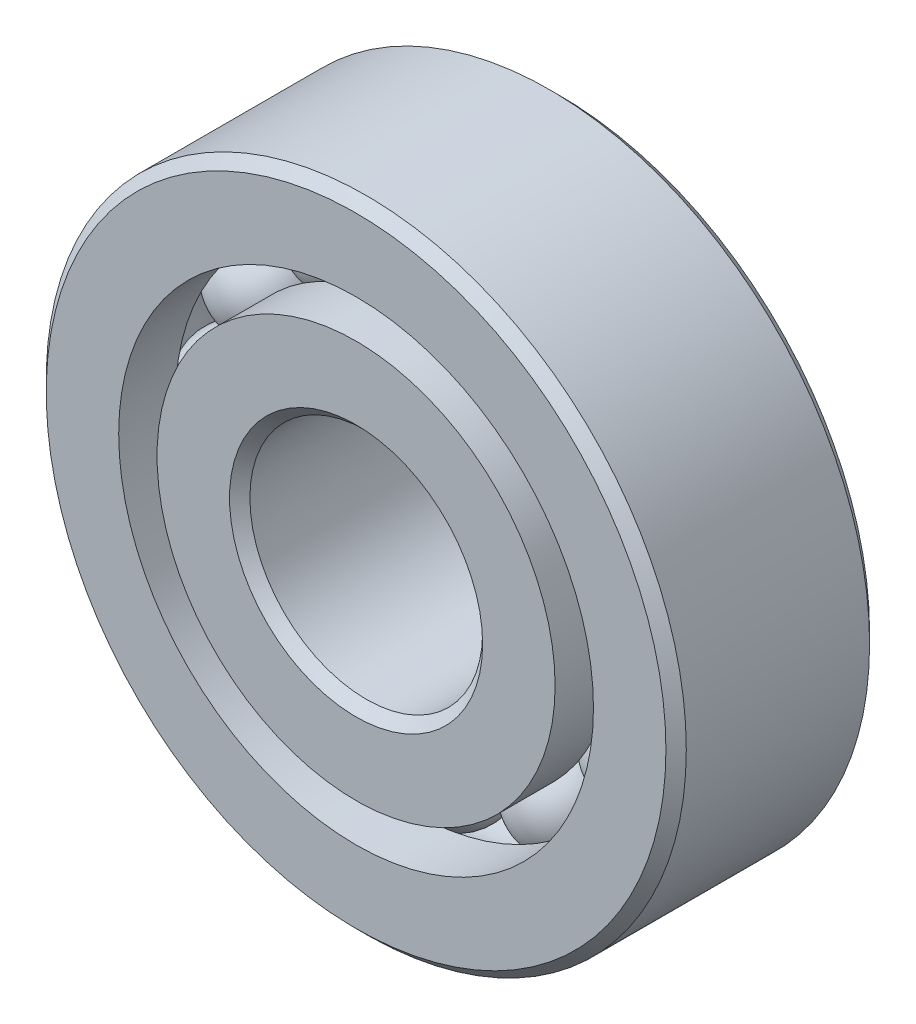
ISO-10303-21;
HEADER;
FILE_DESCRIPTION(('STEP AP214'),'2;1');
FILE_NAME('part.step','',(''),(''),'','','');
FILE_SCHEMA(('AUTOMOTIVE_DESIGN { 1 0 10303 214 1 1 1 1 }'));
ENDSEC;
DATA;
#1=APPLICATION_CONTEXT('core data for automotive mechanical design processes');
#2=APPLICATION_PROTOCOL_DEFINITION('international standard','automotive_design',2000,#1);
#3=PRODUCT_CONTEXT('',#1,'mechanical');
#4=PRODUCT('Part','Part','',(#3));
#5=PRODUCT_RELATED_PRODUCT_CATEGORY('part','',(#4));
#6=PRODUCT_DEFINITION_FORMATION('','',#4);
#7=PRODUCT_DEFINITION_CONTEXT('part definition',#1,'design');
#8=PRODUCT_DEFINITION('design','',#6,#7);
#9=PRODUCT_DEFINITION_SHAPE('','',#8);
#10=(LENGTH_UNIT() NAMED_UNIT(*) SI_UNIT(.MILLI.,.METRE.));
#11=(NAMED_UNIT(*) PLANE_ANGLE_UNIT() SI_UNIT($,.RADIAN.));
#12=(NAMED_UNIT(*) SI_UNIT($,.STERADIAN.) SOLID_ANGLE_UNIT());
#13=UNCERTAINTY_MEASURE_WITH_UNIT(LENGTH_MEASURE(1.E-05),#10,'distance_accuracy_value','');
#14=(GEOMETRIC_REPRESENTATION_CONTEXT(3) GLOBAL_UNCERTAINTY_ASSIGNED_CONTEXT((#13)) GLOBAL_UNIT_ASSIGNED_CONTEXT((#10,
#11,#12)) REPRESENTATION_CONTEXT('',''));
#15=CARTESIAN_POINT('',(0.,0.,0.));
#16=DIRECTION('',(0.,0.,1.));
#17=DIRECTION('',(1.,0.,0.));
#18=AXIS2_PLACEMENT_3D('',#15,#16,#17);
#19=CARTESIAN_POINT('',(-3.74999999999992,6.49519052838334,0.));
#20=DIRECTION('',(0.,0.,1.));
#21=DIRECTION('',(-0.499999999999989,0.866025403784445,0.));
#22=AXIS2_PLACEMENT_3D('',#19,#20,#21);
#23=SPHERICAL_SURFACE('',#22,1.68952158656808);
#24=CARTESIAN_POINT('',(-3.74999999999992,6.49519052838334,1.68952158656808));
#25=VERTEX_POINT('',#24);
#26=VERTEX_LOOP('',#25);
#27=FACE_BOUND('',#26,.T.);
#28=ADVANCED_FACE('F37',(#27),#23,.T.);
#29=CLOSED_SHELL('',(#28));
#30=MANIFOLD_SOLID_BREP('B2',#29);
#31=CARTESIAN_POINT('',(-6.49519052838325,3.75000000000008,0.));
#32=DIRECTION('',(0.,0.,1.));
#33=DIRECTION('',(-0.866025403784433,0.50000000000001,0.));
#34=AXIS2_PLACEMENT_3D('',#31,#32,#33);
#35=SPHERICAL_SURFACE('',#34,1.68952158656808);
#36=CARTESIAN_POINT('',(-6.49519052838325,3.75000000000008,1.68952158656808));
#37=VERTEX_POINT('',#36);
#38=VERTEX_LOOP('',#37);
#39=FACE_BOUND('',#38,.T.);
#40=ADVANCED_FACE('F57',(#39),#35,.T.);
#41=CLOSED_SHELL('',(#40));
#42=MANIFOLD_SOLID_BREP('B6',#41);
#43=CARTESIAN_POINT('',(-7.5,0.,0.));
#44=DIRECTION('',(0.,0.,1.));
#45=DIRECTION('',(-1.,0.,0.));
#46=AXIS2_PLACEMENT_3D('',#43,#44,#45);
#47=SPHERICAL_SURFACE('',#46,1.68952158656808);
#48=CARTESIAN_POINT('',(-7.5,0.,1.68952158656808));
#49=VERTEX_POINT('',#48);
#50=VERTEX_LOOP('',#49);
#51=FACE_BOUND('',#50,.T.);
#52=ADVANCED_FACE('F77',(#51),#47,.T.);
#53=CLOSED_SHELL('',(#52));
#54=MANIFOLD_SOLID_BREP('B33',#53);
#55=CARTESIAN_POINT('',(-6.49519052838332,-3.74999999999994,0.));
#56=DIRECTION('',(0.,0.,1.));
#57=DIRECTION('',(-0.866025403784443,-0.499999999999992,0.));
#58=AXIS2_PLACEMENT_3D('',#55,#56,#57);
#59=SPHERICAL_SURFACE('',#58,1.68952158656808);
#60=CARTESIAN_POINT('',(-6.49519052838332,-3.74999999999994,1.68952158656808));
#61=VERTEX_POINT('',#60);
#62=VERTEX_LOOP('',#61);
#63=FACE_BOUND('',#62,.T.);
#64=ADVANCED_FACE('F97',(#63),#59,.T.);
#65=CLOSED_SHELL('',(#64));
#66=MANIFOLD_SOLID_BREP('B53',#65);
#67=CARTESIAN_POINT('',(-3.75000000000005,-6.49519052838326,0.));
#68=DIRECTION('',(0.,0.,1.));
#69=DIRECTION('',(-0.500000000000007,-0.866025403784435,0.));
#70=AXIS2_PLACEMENT_3D('',#67,#68,#69);
#71=SPHERICAL_SURFACE('',#70,1.68952158656808);
#72=CARTESIAN_POINT('',(-3.75000000000005,-6.49519052838326,1.68952158656808));
#73=VERTEX_POINT('',#72);
#74=VERTEX_LOOP('',#73);
#75=FACE_BOUND('',#74,.T.);
#76=ADVANCED_FACE('F117',(#75),#71,.T.);
#77=CLOSED_SHELL('',(#76));
#78=MANIFOLD_SOLID_BREP('B73',#77);
#79=CARTESIAN_POINT('',(0.,-7.5,0.));
#80=DIRECTION('',(0.,0.,1.));
#81=DIRECTION('',(0.,-1.,0.));
#82=AXIS2_PLACEMENT_3D('',#79,#80,#81);
#83=SPHERICAL_SURFACE('',#82,1.68952158656808);
#84=CARTESIAN_POINT('',(0.,-7.5,1.68952158656808));
#85=VERTEX_POINT('',#84);
#86=VERTEX_LOOP('',#85);
#87=FACE_BOUND('',#86,.T.);
#88=ADVANCED_FACE('F137',(#87),#83,.T.);
#89=CLOSED_SHELL('',(#88));
#90=MANIFOLD_SOLID_BREP('B93',#89);
#91=CARTESIAN_POINT('',(3.74999999999996,-6.49519052838331,0.));
#92=DIRECTION('',(0.,0.,1.));
#93=DIRECTION('',(0.499999999999995,-0.866025403784442,0.));
#94=AXIS2_PLACEMENT_3D('',#91,#92,#93);
#95=SPHERICAL_SURFACE('',#94,1.68952158656808);
#96=CARTESIAN_POINT('',(3.74999999999996,-6.49519052838331,1.68952158656808));
#97=VERTEX_POINT('',#96);
#98=VERTEX_LOOP('',#97);
#99=FACE_BOUND('',#98,.T.);
#100=ADVANCED_FACE('F157',(#99),#95,.T.);
#101=CLOSED_SHELL('',(#100));
#102=MANIFOLD_SOLID_BREP('B113',#101);
#103=CARTESIAN_POINT('',(6.49519052838327,-3.75000000000003,0.));
#104=DIRECTION('',(0.,0.,1.));
#105=DIRECTION('',(0.866025403784436,-0.500000000000004,0.));
#106=AXIS2_PLACEMENT_3D('',#103,#104,#105);
#107=SPHERICAL_SURFACE('',#106,1.68952158656808);
#108=CARTESIAN_POINT('',(6.49519052838327,-3.75000000000003,1.68952158656808));
#109=VERTEX_POINT('',#108);
#110=VERTEX_LOOP('',#109);
#111=FACE_BOUND('',#110,.T.);
#112=ADVANCED_FACE('F177',(#111),#107,.T.);
#113=CLOSED_SHELL('',(#112));
#114=MANIFOLD_SOLID_BREP('B133',#113);
#115=CARTESIAN_POINT('',(7.5,0.,0.));
#116=DIRECTION('',(0.,0.,1.));
#117=DIRECTION('',(1.,0.,0.));
#118=AXIS2_PLACEMENT_3D('',#115,#116,#117);
#119=SPHERICAL_SURFACE('',#118,1.68952158656808);
#120=CARTESIAN_POINT('',(7.5,0.,1.68952158656808));
#121=VERTEX_POINT('',#120);
#122=VERTEX_LOOP('',#121);
#123=FACE_BOUND('',#122,.T.);
#124=ADVANCED_FACE('F197',(#123),#119,.T.);
#125=CLOSED_SHELL('',(#124));
#126=MANIFOLD_SOLID_BREP('B153',#125);
#127=CARTESIAN_POINT('',(6.4951905283833,3.74999999999998,0.));
#128=DIRECTION('',(0.,0.,1.));
#129=DIRECTION('',(0.86602540378444,0.499999999999998,0.));
#130=AXIS2_PLACEMENT_3D('',#127,#128,#129);
#131=SPHERICAL_SURFACE('',#130,1.68952158656808);
#132=CARTESIAN_POINT('',(6.4951905283833,3.74999999999998,1.68952158656808));
#133=VERTEX_POINT('',#132);
#134=VERTEX_LOOP('',#133);
#135=FACE_BOUND('',#134,.T.);
#136=ADVANCED_FACE('F217',(#135),#131,.T.);
#137=CLOSED_SHELL('',(#136));
#138=MANIFOLD_SOLID_BREP('B173',#137);
#139=CARTESIAN_POINT('',(3.75000000000001,6.49519052838328,0.));
#140=DIRECTION('',(0.,0.,1.));
#141=DIRECTION('',(0.500000000000001,0.866025403784438,0.));
#142=AXIS2_PLACEMENT_3D('',#139,#140,#141);
#143=SPHERICAL_SURFACE('',#142,1.68952158656808);
#144=CARTESIAN_POINT('',(3.75000000000001,6.49519052838328,1.68952158656808));
#145=VERTEX_POINT('',#144);
#146=VERTEX_LOOP('',#145);
#147=FACE_BOUND('',#146,.T.);
#148=ADVANCED_FACE('F237',(#147),#143,.T.);
#149=CLOSED_SHELL('',(#148));
#150=MANIFOLD_SOLID_BREP('B193',#149);
#151=CARTESIAN_POINT('',(0.,7.5,0.));
#152=DIRECTION('',(0.,0.,1.));
#153=DIRECTION('',(0.,1.,0.));
#154=AXIS2_PLACEMENT_3D('',#151,#152,#153);
#155=SPHERICAL_SURFACE('',#154,1.68952158656808);
#156=CARTESIAN_POINT('',(0.,7.5,1.68952158656808));
#157=VERTEX_POINT('',#156);
#158=VERTEX_LOOP('',#157);
#159=FACE_BOUND('',#158,.T.);
#160=ADVANCED_FACE('F259',(#159),#155,.T.);
#161=CLOSED_SHELL('',(#160));
#162=MANIFOLD_SOLID_BREP('B213',#161);
#163=CARTESIAN_POINT('',(0.,6.84065934065934,3.5));
#164=DIRECTION('',(0.,0.,-1.));
#165=DIRECTION('',(-1.,0.,0.));
#166=AXIS2_PLACEMENT_3D('',#163,#164,#165);
#167=PLANE('',#166);
#168=CARTESIAN_POINT('',(0.,0.,3.5));
#169=DIRECTION('',(0.,0.,1.));
#170=DIRECTION('',(1.,0.,0.));
#171=AXIS2_PLACEMENT_3D('',#168,#169,#170);
#172=CIRCLE('',#171,4.35);
#173=CARTESIAN_POINT('',(4.35,0.,3.5));
#174=VERTEX_POINT('',#173);
#175=EDGE_CURVE('E306',#174,#174,#172,.T.);
#176=ORIENTED_EDGE('',*,*,#175,.F.);
#177=EDGE_LOOP('',(#176));
#178=FACE_BOUND('',#177,.T.);
#179=CARTESIAN_POINT('',(0.,0.,3.5));
#180=DIRECTION('',(0.,0.,1.));
#181=DIRECTION('',(1.,0.,0.));
#182=AXIS2_PLACEMENT_3D('',#179,#180,#181);
#183=CIRCLE('',#182,6.84065934065934);
#184=CARTESIAN_POINT('',(6.84065934065934,0.,3.5));
#185=VERTEX_POINT('',#184);
#186=EDGE_CURVE('E258',#185,#185,#183,.T.);
#187=ORIENTED_EDGE('',*,*,#186,.T.);
#188=EDGE_LOOP('',(#187));
#189=FACE_BOUND('',#188,.T.);
#190=ADVANCED_FACE('F278',(#178,#189),#167,.F.);
#191=CARTESIAN_POINT('',(0.,0.,3.5));
#192=DIRECTION('',(0.,0.,1.));
#193=DIRECTION('',(1.,0.,0.));
#194=AXIS2_PLACEMENT_3D('',#191,#192,#193);
#195=CYLINDRICAL_SURFACE('',#194,6.84065934065934);
#196=ORIENTED_EDGE('',*,*,#186,.F.);
#197=EDGE_LOOP('',(#196));
#198=FACE_BOUND('',#197,.T.);
#199=CARTESIAN_POINT('',(0.,0.,1.55555555555556));
#200=DIRECTION('',(0.,0.,1.));
#201=DIRECTION('',(1.,0.,0.));
#202=AXIS2_PLACEMENT_3D('',#199,#200,#201);
#203=CIRCLE('',#202,6.84065934065934);
#204=CARTESIAN_POINT('',(6.84065934065934,0.,1.55555555555556));
#205=VERTEX_POINT('',#204);
#206=EDGE_CURVE('E284',#205,#205,#203,.T.);
#207=ORIENTED_EDGE('',*,*,#206,.T.);
#208=EDGE_LOOP('',(#207));
#209=FACE_BOUND('',#208,.T.);
#210=ADVANCED_FACE('F313',(#198,#209),#195,.T.);
#211=CARTESIAN_POINT('',(0.,0.,0.));
#212=DIRECTION('',(0.,0.,1.));
#213=DIRECTION('',(1.,0.,0.));
#214=AXIS2_PLACEMENT_3D('',#211,#212,#213);
#215=TOROIDAL_SURFACE('',#214,7.5,1.68952158656808);
#216=ORIENTED_EDGE('',*,*,#206,.F.);
#217=EDGE_LOOP('',(#216));
#218=FACE_BOUND('',#217,.T.);
#219=CARTESIAN_POINT('',(0.,0.,-1.55555555555556));
#220=DIRECTION('',(0.,0.,1.));
#221=DIRECTION('',(1.,0.,0.));
#222=AXIS2_PLACEMENT_3D('',#219,#220,#221);
#223=CIRCLE('',#222,6.84065934065934);
#224=CARTESIAN_POINT('',(6.84065934065934,0.,-1.55555555555556));
#225=VERTEX_POINT('',#224);
#226=EDGE_CURVE('E288',#225,#225,#223,.T.);
#227=ORIENTED_EDGE('',*,*,#226,.T.);
#228=EDGE_LOOP('',(#227));
#229=FACE_BOUND('',#228,.T.);
#230=ADVANCED_FACE('F317',(#218,#229),#215,.F.);
#231=CARTESIAN_POINT('',(0.,0.,3.5));
#232=DIRECTION('',(0.,0.,1.));
#233=DIRECTION('',(1.,0.,0.));
#234=AXIS2_PLACEMENT_3D('',#231,#232,#233);
#235=CYLINDRICAL_SURFACE('',#234,6.84065934065934);
#236=ORIENTED_EDGE('',*,*,#226,.F.);
#237=EDGE_LOOP('',(#236));
#238=FACE_BOUND('',#237,.T.);
#239=CARTESIAN_POINT('',(0.,0.,-3.5));
#240=DIRECTION('',(0.,0.,1.));
#241=DIRECTION('',(1.,0.,0.));
#242=AXIS2_PLACEMENT_3D('',#239,#240,#241);
#243=CIRCLE('',#242,6.84065934065934);
#244=CARTESIAN_POINT('',(6.84065934065934,0.,-3.5));
#245=VERTEX_POINT('',#244);
#246=EDGE_CURVE('E292',#245,#245,#243,.T.);
#247=ORIENTED_EDGE('',*,*,#246,.T.);
#248=EDGE_LOOP('',(#247));
#249=FACE_BOUND('',#248,.T.);
#250=ADVANCED_FACE('F322',(#238,#249),#235,.T.);
#251=CARTESIAN_POINT('',(0.,4.35,-3.5));
#252=DIRECTION('',(0.,0.,1.));
#253=DIRECTION('',(1.,0.,0.));
#254=AXIS2_PLACEMENT_3D('',#251,#252,#253);
#255=PLANE('',#254);
#256=ORIENTED_EDGE('',*,*,#246,.F.);
#257=EDGE_LOOP('',(#256));
#258=FACE_BOUND('',#257,.T.);
#259=CARTESIAN_POINT('',(0.,0.,-3.5));
#260=DIRECTION('',(0.,0.,1.));
#261=DIRECTION('',(1.,0.,0.));
#262=AXIS2_PLACEMENT_3D('',#259,#260,#261);
#263=CIRCLE('',#262,4.35);
#264=CARTESIAN_POINT('',(4.35,0.,-3.5));
#265=VERTEX_POINT('',#264);
#266=EDGE_CURVE('E297',#265,#265,#263,.T.);
#267=ORIENTED_EDGE('',*,*,#266,.T.);
#268=EDGE_LOOP('',(#267));
#269=FACE_BOUND('',#268,.T.);
#270=ADVANCED_FACE('F328',(#258,#269),#255,.F.);
#271=CARTESIAN_POINT('',(0.,0.,-3.15));
#272=DIRECTION('',(0.,0.,-1.));
#273=DIRECTION('',(-1.,0.,0.));
#274=AXIS2_PLACEMENT_3D('',#271,#272,#273);
#275=CONICAL_SURFACE('',#274,4.,0.78539816339745);
#276=ORIENTED_EDGE('',*,*,#266,.F.);
#277=EDGE_LOOP('',(#276));
#278=FACE_BOUND('',#277,.T.);
#279=CARTESIAN_POINT('',(0.,0.,-3.15));
#280=DIRECTION('',(0.,0.,1.));
#281=DIRECTION('',(1.,0.,0.));
#282=AXIS2_PLACEMENT_3D('',#279,#280,#281);
#283=CIRCLE('',#282,4.);
#284=CARTESIAN_POINT('',(4.,0.,-3.15));
#285=VERTEX_POINT('',#284);
#286=EDGE_CURVE('E300',#285,#285,#283,.T.);
#287=ORIENTED_EDGE('',*,*,#286,.T.);
#288=EDGE_LOOP('',(#287));
#289=FACE_BOUND('',#288,.T.);
#290=ADVANCED_FACE('F332',(#278,#289),#275,.F.);
#291=CARTESIAN_POINT('',(0.,0.,3.5));
#292=DIRECTION('',(0.,0.,1.));
#293=DIRECTION('',(1.,0.,0.));
#294=AXIS2_PLACEMENT_3D('',#291,#292,#293);
#295=CYLINDRICAL_SURFACE('',#294,4.);
#296=ORIENTED_EDGE('',*,*,#286,.F.);
#297=EDGE_LOOP('',(#296));
#298=FACE_BOUND('',#297,.T.);
#299=CARTESIAN_POINT('',(0.,0.,3.15));
#300=DIRECTION('',(0.,0.,1.));
#301=DIRECTION('',(1.,0.,0.));
#302=AXIS2_PLACEMENT_3D('',#299,#300,#301);
#303=CIRCLE('',#302,4.);
#304=CARTESIAN_POINT('',(4.,0.,3.15));
#305=VERTEX_POINT('',#304);
#306=EDGE_CURVE('E303',#305,#305,#303,.T.);
#307=ORIENTED_EDGE('',*,*,#306,.T.);
#308=EDGE_LOOP('',(#307));
#309=FACE_BOUND('',#308,.T.);
#310=ADVANCED_FACE('F336',(#298,#309),#295,.F.);
#311=CARTESIAN_POINT('',(0.,0.,3.5));
#312=DIRECTION('',(0.,0.,1.));
#313=DIRECTION('',(1.,0.,0.));
#314=AXIS2_PLACEMENT_3D('',#311,#312,#313);
#315=CONICAL_SURFACE('',#314,4.35,0.78539816339745);
#316=ORIENTED_EDGE('',*,*,#306,.F.);
#317=EDGE_LOOP('',(#316));
#318=FACE_BOUND('',#317,.T.);
#319=ORIENTED_EDGE('',*,*,#175,.T.);
#320=EDGE_LOOP('',(#319));
#321=FACE_BOUND('',#320,.T.);
#322=ADVANCED_FACE('F310',(#318,#321),#315,.F.);
#323=CLOSED_SHELL('',(#190,#210,#230,#250,#270,#290,#310,#322));
#324=MANIFOLD_SOLID_BREP('B233',#323);
#325=CARTESIAN_POINT('',(0.,0.,3.15));
#326=DIRECTION('',(0.,0.,-1.));
#327=DIRECTION('',(-1.,0.,0.));
#328=AXIS2_PLACEMENT_3D('',#325,#326,#327);
#329=CONICAL_SURFACE('',#328,11.,0.785398163397448);
#330=CARTESIAN_POINT('',(0.,0.,3.5));
#331=DIRECTION('',(0.,0.,1.));
#332=DIRECTION('',(1.,0.,0.));
#333=AXIS2_PLACEMENT_3D('',#330,#331,#332);
#334=CIRCLE('',#333,10.65);
#335=CARTESIAN_POINT('',(10.65,0.,3.5));
#336=VERTEX_POINT('',#335);
#337=EDGE_CURVE('E427',#336,#336,#334,.T.);
#338=ORIENTED_EDGE('',*,*,#337,.F.);
#339=EDGE_LOOP('',(#338));
#340=FACE_BOUND('',#339,.T.);
#341=CARTESIAN_POINT('',(0.,0.,3.15));
#342=DIRECTION('',(0.,0.,1.));
#343=DIRECTION('',(1.,0.,0.));
#344=AXIS2_PLACEMENT_3D('',#341,#342,#343);
#345=CIRCLE('',#344,11.);
#346=CARTESIAN_POINT('',(11.,0.,3.15));
#347=VERTEX_POINT('',#346);
#348=EDGE_CURVE('E277',#347,#347,#345,.T.);
#349=ORIENTED_EDGE('',*,*,#348,.T.);
#350=EDGE_LOOP('',(#349));
#351=FACE_BOUND('',#350,.T.);
#352=ADVANCED_FACE('F399',(#340,#351),#329,.T.);
#353=CARTESIAN_POINT('',(0.,0.,3.5));
#354=DIRECTION('',(0.,0.,1.));
#355=DIRECTION('',(1.,0.,0.));
#356=AXIS2_PLACEMENT_3D('',#353,#354,#355);
#357=CYLINDRICAL_SURFACE('',#356,11.);
#358=ORIENTED_EDGE('',*,*,#348,.F.);
#359=EDGE_LOOP('',(#358));
#360=FACE_BOUND('',#359,.T.);
#361=CARTESIAN_POINT('',(0.,0.,-3.15));
#362=DIRECTION('',(0.,0.,1.));
#363=DIRECTION('',(1.,0.,0.));
#364=AXIS2_PLACEMENT_3D('',#361,#362,#363);
#365=CIRCLE('',#364,11.);
#366=CARTESIAN_POINT('',(11.,0.,-3.15));
#367=VERTEX_POINT('',#366);
#368=EDGE_CURVE('E405',#367,#367,#365,.T.);
#369=ORIENTED_EDGE('',*,*,#368,.T.);
#370=EDGE_LOOP('',(#369));
#371=FACE_BOUND('',#370,.T.);
#372=ADVANCED_FACE('F434',(#360,#371),#357,.T.);
#373=CARTESIAN_POINT('',(0.,0.,-3.5));
#374=DIRECTION('',(0.,0.,1.));
#375=DIRECTION('',(1.,0.,0.));
#376=AXIS2_PLACEMENT_3D('',#373,#374,#375);
#377=CONICAL_SURFACE('',#376,10.65,0.785398163397448);
#378=ORIENTED_EDGE('',*,*,#368,.F.);
#379=EDGE_LOOP('',(#378));
#380=FACE_BOUND('',#379,.T.);
#381=CARTESIAN_POINT('',(0.,0.,-3.5));
#382=DIRECTION('',(0.,0.,1.));
#383=DIRECTION('',(1.,0.,0.));
#384=AXIS2_PLACEMENT_3D('',#381,#382,#383);
#385=CIRCLE('',#384,10.65);
#386=CARTESIAN_POINT('',(10.65,0.,-3.5));
#387=VERTEX_POINT('',#386);
#388=EDGE_CURVE('E409',#387,#387,#385,.T.);
#389=ORIENTED_EDGE('',*,*,#388,.T.);
#390=EDGE_LOOP('',(#389));
#391=FACE_BOUND('',#390,.T.);
#392=ADVANCED_FACE('F438',(#380,#391),#377,.T.);
#393=CARTESIAN_POINT('',(0.,10.65,-3.5));
#394=DIRECTION('',(0.,0.,1.));
#395=DIRECTION('',(1.,0.,0.));
#396=AXIS2_PLACEMENT_3D('',#393,#394,#395);
#397=PLANE('',#396);
#398=ORIENTED_EDGE('',*,*,#388,.F.);
#399=EDGE_LOOP('',(#398));
#400=FACE_BOUND('',#399,.T.);
#401=CARTESIAN_POINT('',(0.,0.,-3.5));
#402=DIRECTION('',(0.,0.,1.));
#403=DIRECTION('',(1.,0.,0.));
#404=AXIS2_PLACEMENT_3D('',#401,#402,#403);
#405=CIRCLE('',#404,8.15934065934066);
#406=CARTESIAN_POINT('',(8.15934065934066,0.,-3.5));
#407=VERTEX_POINT('',#406);
#408=EDGE_CURVE('E413',#407,#407,#405,.T.);
#409=ORIENTED_EDGE('',*,*,#408,.T.);
#410=EDGE_LOOP('',(#409));
#411=FACE_BOUND('',#410,.T.);
#412=ADVANCED_FACE('F443',(#400,#411),#397,.F.);
#413=CARTESIAN_POINT('',(0.,0.,3.5));
#414=DIRECTION('',(0.,0.,1.));
#415=DIRECTION('',(1.,0.,0.));
#416=AXIS2_PLACEMENT_3D('',#413,#414,#415);
#417=CYLINDRICAL_SURFACE('',#416,8.15934065934066);
#418=ORIENTED_EDGE('',*,*,#408,.F.);
#419=EDGE_LOOP('',(#418));
#420=FACE_BOUND('',#419,.T.);
#421=CARTESIAN_POINT('',(0.,0.,-1.55555555555556));
#422=DIRECTION('',(0.,0.,1.));
#423=DIRECTION('',(1.,0.,0.));
#424=AXIS2_PLACEMENT_3D('',#421,#422,#423);
#425=CIRCLE('',#424,8.15934065934066);
#426=CARTESIAN_POINT('',(8.15934065934066,0.,-1.55555555555556));
#427=VERTEX_POINT('',#426);
#428=EDGE_CURVE('E418',#427,#427,#425,.T.);
#429=ORIENTED_EDGE('',*,*,#428,.T.);
#430=EDGE_LOOP('',(#429));
#431=FACE_BOUND('',#430,.T.);
#432=ADVANCED_FACE('F449',(#420,#431),#417,.F.);
#433=CARTESIAN_POINT('',(0.,0.,0.));
#434=DIRECTION('',(0.,0.,1.));
#435=DIRECTION('',(1.,0.,0.));
#436=AXIS2_PLACEMENT_3D('',#433,#434,#435);
#437=TOROIDAL_SURFACE('',#436,7.5,1.68952158656808);
#438=ORIENTED_EDGE('',*,*,#428,.F.);
#439=EDGE_LOOP('',(#438));
#440=FACE_BOUND('',#439,.T.);
#441=CARTESIAN_POINT('',(0.,0.,1.55555555555556));
#442=DIRECTION('',(0.,0.,1.));
#443=DIRECTION('',(1.,0.,0.));
#444=AXIS2_PLACEMENT_3D('',#441,#442,#443);
#445=CIRCLE('',#444,8.15934065934066);
#446=CARTESIAN_POINT('',(8.15934065934066,0.,1.55555555555556));
#447=VERTEX_POINT('',#446);
#448=EDGE_CURVE('E421',#447,#447,#445,.T.);
#449=ORIENTED_EDGE('',*,*,#448,.T.);
#450=EDGE_LOOP('',(#449));
#451=FACE_BOUND('',#450,.T.);
#452=ADVANCED_FACE('F453',(#440,#451),#437,.F.);
#453=CARTESIAN_POINT('',(0.,0.,3.5));
#454=DIRECTION('',(0.,0.,1.));
#455=DIRECTION('',(1.,0.,0.));
#456=AXIS2_PLACEMENT_3D('',#453,#454,#455);
#457=CYLINDRICAL_SURFACE('',#456,8.15934065934066);
#458=ORIENTED_EDGE('',*,*,#448,.F.);
#459=EDGE_LOOP('',(#458));
#460=FACE_BOUND('',#459,.T.);
#461=CARTESIAN_POINT('',(0.,0.,3.5));
#462=DIRECTION('',(0.,0.,1.));
#463=DIRECTION('',(1.,0.,0.));
#464=AXIS2_PLACEMENT_3D('',#461,#462,#463);
#465=CIRCLE('',#464,8.15934065934066);
#466=CARTESIAN_POINT('',(8.15934065934066,0.,3.5));
#467=VERTEX_POINT('',#466);
#468=EDGE_CURVE('E424',#467,#467,#465,.T.);
#469=ORIENTED_EDGE('',*,*,#468,.T.);
#470=EDGE_LOOP('',(#469));
#471=FACE_BOUND('',#470,.T.);
#472=ADVANCED_FACE('F457',(#460,#471),#457,.F.);
#473=CARTESIAN_POINT('',(0.,10.65,3.5));
#474=DIRECTION('',(0.,0.,-1.));
#475=DIRECTION('',(-1.,0.,0.));
#476=AXIS2_PLACEMENT_3D('',#473,#474,#475);
#477=PLANE('',#476);
#478=ORIENTED_EDGE('',*,*,#468,.F.);
#479=EDGE_LOOP('',(#478));
#480=FACE_BOUND('',#479,.T.);
#481=ORIENTED_EDGE('',*,*,#337,.T.);
#482=EDGE_LOOP('',(#481));
#483=FACE_BOUND('',#482,.T.);
#484=ADVANCED_FACE('F431',(#480,#483),#477,.F.);
#485=CLOSED_SHELL('',(#352,#372,#392,#412,#432,#452,#472,#484));
#486=MANIFOLD_SOLID_BREP('B253',#485);
#487=ADVANCED_BREP_SHAPE_REPRESENTATION('',(#18,#30,#42,#54,#66,#78,#90,#102,#114,#126,#138,
#150,#162,#324,#486),#14);
#488=SHAPE_DEFINITION_REPRESENTATION(#9,#487);
ENDSEC;
END-ISO-10303-21;
